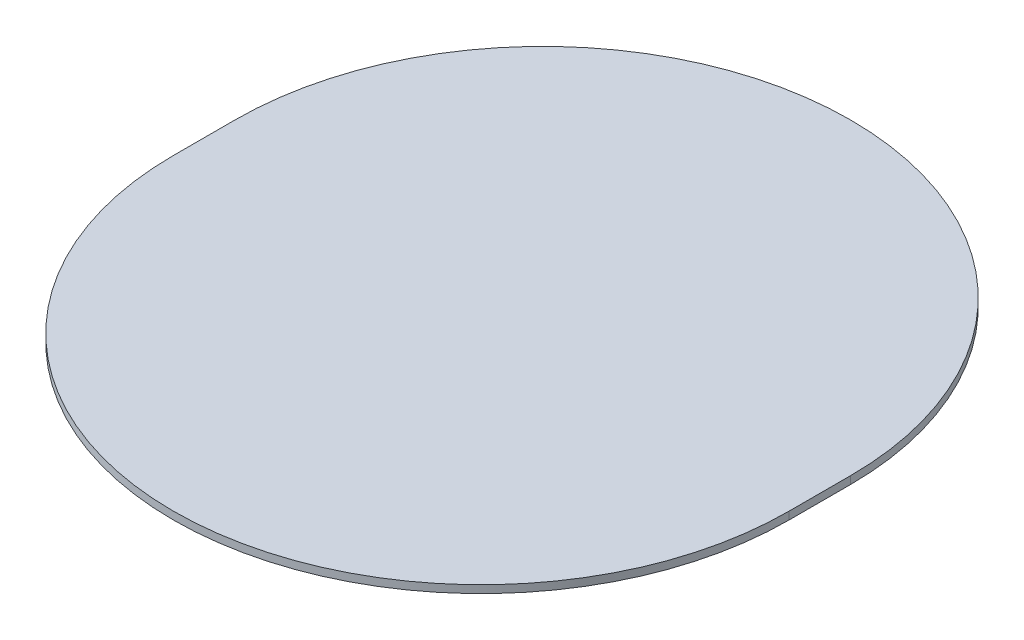
ISO-10303-21;
HEADER;
FILE_DESCRIPTION(('STEP AP214'),'2;1');
FILE_NAME('part.step','',(''),(''),'','','');
FILE_SCHEMA(('AUTOMOTIVE_DESIGN { 1 0 10303 214 1 1 1 1 }'));
ENDSEC;
DATA;
#1=APPLICATION_CONTEXT('core data for automotive mechanical design processes');
#2=APPLICATION_PROTOCOL_DEFINITION('international standard','automotive_design',2000,#1);
#3=PRODUCT_CONTEXT('',#1,'mechanical');
#4=PRODUCT('Part','Part','',(#3));
#5=PRODUCT_RELATED_PRODUCT_CATEGORY('part','',(#4));
#6=PRODUCT_DEFINITION_FORMATION('','',#4);
#7=PRODUCT_DEFINITION_CONTEXT('part definition',#1,'design');
#8=PRODUCT_DEFINITION('design','',#6,#7);
#9=PRODUCT_DEFINITION_SHAPE('','',#8);
#10=(LENGTH_UNIT() NAMED_UNIT(*) SI_UNIT(.MILLI.,.METRE.));
#11=(NAMED_UNIT(*) PLANE_ANGLE_UNIT() SI_UNIT($,.RADIAN.));
#12=(NAMED_UNIT(*) SI_UNIT($,.STERADIAN.) SOLID_ANGLE_UNIT());
#13=UNCERTAINTY_MEASURE_WITH_UNIT(LENGTH_MEASURE(1.E-05),#10,'distance_accuracy_value','');
#14=(GEOMETRIC_REPRESENTATION_CONTEXT(3) GLOBAL_UNCERTAINTY_ASSIGNED_CONTEXT((#13)) GLOBAL_UNIT_ASSIGNED_CONTEXT((#10,
#11,#12)) REPRESENTATION_CONTEXT('',''));
#15=CARTESIAN_POINT('',(0.,0.,0.));
#16=DIRECTION('',(0.,0.,1.));
#17=DIRECTION('',(1.,0.,0.));
#18=AXIS2_PLACEMENT_3D('',#15,#16,#17);
#19=CARTESIAN_POINT('',(0.,3.175,-12.7));
#20=DIRECTION('',(0.,-1.,0.));
#21=DIRECTION('',(0.,0.,-1.));
#22=AXIS2_PLACEMENT_3D('',#19,#20,#21);
#23=CYLINDRICAL_SURFACE('',#22,127.);
#24=CARTESIAN_POINT('',(0.,0.,-12.7));
#25=DIRECTION('',(0.,1.,0.));
#26=DIRECTION('',(0.,0.,-1.));
#27=AXIS2_PLACEMENT_3D('',#24,#25,#26);
#28=CIRCLE('',#27,127.);
#29=CARTESIAN_POINT('',(127.,0.,-12.7));
#30=VERTEX_POINT('',#29);
#31=CARTESIAN_POINT('',(-127.,0.,-12.7));
#32=VERTEX_POINT('',#31);
#33=EDGE_CURVE('E96',#30,#32,#28,.T.);
#34=ORIENTED_EDGE('',*,*,#33,.T.);
#35=DIRECTION('',(0.,-1.,0.));
#36=VECTOR('',#35,1.);
#37=CARTESIAN_POINT('',(-127.,3.175,-12.7));
#38=LINE('',#37,#36);
#39=CARTESIAN_POINT('',(-127.,3.175,-12.7));
#40=VERTEX_POINT('',#39);
#41=EDGE_CURVE('E11',#40,#32,#38,.T.);
#42=ORIENTED_EDGE('',*,*,#41,.F.);
#43=CARTESIAN_POINT('',(0.,3.175,-12.7));
#44=DIRECTION('',(0.,1.,0.));
#45=DIRECTION('',(0.,0.,-1.));
#46=AXIS2_PLACEMENT_3D('',#43,#44,#45);
#47=CIRCLE('',#46,127.);
#48=CARTESIAN_POINT('',(127.,3.175,-12.7));
#49=VERTEX_POINT('',#48);
#50=EDGE_CURVE('E84',#49,#40,#47,.T.);
#51=ORIENTED_EDGE('',*,*,#50,.F.);
#52=DIRECTION('',(0.,-1.,0.));
#53=VECTOR('',#52,1.);
#54=CARTESIAN_POINT('',(127.,3.175,-12.7));
#55=LINE('',#54,#53);
#56=EDGE_CURVE('E92',#49,#30,#55,.T.);
#57=ORIENTED_EDGE('',*,*,#56,.T.);
#58=EDGE_LOOP('',(#34,#42,#51,#57));
#59=FACE_BOUND('',#58,.T.);
#60=ADVANCED_FACE('F33',(#59),#23,.T.);
#61=CARTESIAN_POINT('',(-127.,3.175,12.7));
#62=DIRECTION('',(1.,0.,0.));
#63=DIRECTION('',(0.,0.,-1.));
#64=AXIS2_PLACEMENT_3D('',#61,#62,#63);
#65=PLANE('',#64);
#66=DIRECTION('',(0.,0.,1.));
#67=VECTOR('',#66,1.);
#68=CARTESIAN_POINT('',(-127.,0.,12.7));
#69=LINE('',#68,#67);
#70=CARTESIAN_POINT('',(-127.,0.,12.7));
#71=VERTEX_POINT('',#70);
#72=EDGE_CURVE('E88',#32,#71,#69,.T.);
#73=ORIENTED_EDGE('',*,*,#72,.T.);
#74=DIRECTION('',(0.,-1.,0.));
#75=VECTOR('',#74,1.);
#76=CARTESIAN_POINT('',(-127.,3.175,12.7));
#77=LINE('',#76,#75);
#78=CARTESIAN_POINT('',(-127.,3.175,12.7));
#79=VERTEX_POINT('',#78);
#80=EDGE_CURVE('E41',#79,#71,#77,.T.);
#81=ORIENTED_EDGE('',*,*,#80,.F.);
#82=DIRECTION('',(0.,0.,1.));
#83=VECTOR('',#82,1.);
#84=CARTESIAN_POINT('',(-127.,3.175,12.7));
#85=LINE('',#84,#83);
#86=EDGE_CURVE('E79',#40,#79,#85,.T.);
#87=ORIENTED_EDGE('',*,*,#86,.F.);
#88=ORIENTED_EDGE('',*,*,#41,.T.);
#89=EDGE_LOOP('',(#73,#81,#87,#88));
#90=FACE_BOUND('',#89,.T.);
#91=ADVANCED_FACE('F87',(#90),#65,.F.);
#92=CARTESIAN_POINT('',(0.,3.175,12.7));
#93=DIRECTION('',(0.,-1.,0.));
#94=DIRECTION('',(0.,0.,-1.));
#95=AXIS2_PLACEMENT_3D('',#92,#93,#94);
#96=CYLINDRICAL_SURFACE('',#95,127.);
#97=CARTESIAN_POINT('',(0.,0.,12.7));
#98=DIRECTION('',(0.,1.,0.));
#99=DIRECTION('',(0.,0.,1.));
#100=AXIS2_PLACEMENT_3D('',#97,#98,#99);
#101=CIRCLE('',#100,127.);
#102=CARTESIAN_POINT('',(127.,0.,12.7));
#103=VERTEX_POINT('',#102);
#104=EDGE_CURVE('E66',#71,#103,#101,.T.);
#105=ORIENTED_EDGE('',*,*,#104,.T.);
#106=DIRECTION('',(0.,-1.,0.));
#107=VECTOR('',#106,1.);
#108=CARTESIAN_POINT('',(127.,3.175,12.7));
#109=LINE('',#108,#107);
#110=CARTESIAN_POINT('',(127.,3.175,12.7));
#111=VERTEX_POINT('',#110);
#112=EDGE_CURVE('E89',#111,#103,#109,.T.);
#113=ORIENTED_EDGE('',*,*,#112,.F.);
#114=CARTESIAN_POINT('',(0.,3.175,12.7));
#115=DIRECTION('',(0.,1.,0.));
#116=DIRECTION('',(0.,0.,1.));
#117=AXIS2_PLACEMENT_3D('',#114,#115,#116);
#118=CIRCLE('',#117,127.);
#119=EDGE_CURVE('E82',#79,#111,#118,.T.);
#120=ORIENTED_EDGE('',*,*,#119,.F.);
#121=ORIENTED_EDGE('',*,*,#80,.T.);
#122=EDGE_LOOP('',(#105,#113,#120,#121));
#123=FACE_BOUND('',#122,.T.);
#124=ADVANCED_FACE('F90',(#123),#96,.T.);
#125=CARTESIAN_POINT('',(127.,3.175,12.7));
#126=DIRECTION('',(-1.,0.,0.));
#127=DIRECTION('',(0.,0.,1.));
#128=AXIS2_PLACEMENT_3D('',#125,#126,#127);
#129=PLANE('',#128);
#130=DIRECTION('',(0.,0.,-1.));
#131=VECTOR('',#130,1.);
#132=CARTESIAN_POINT('',(127.,0.,12.7));
#133=LINE('',#132,#131);
#134=EDGE_CURVE('E72',#103,#30,#133,.T.);
#135=ORIENTED_EDGE('',*,*,#134,.T.);
#136=ORIENTED_EDGE('',*,*,#56,.F.);
#137=DIRECTION('',(0.,0.,-1.));
#138=VECTOR('',#137,1.);
#139=CARTESIAN_POINT('',(127.,3.175,12.7));
#140=LINE('',#139,#138);
#141=EDGE_CURVE('E49',#111,#49,#140,.T.);
#142=ORIENTED_EDGE('',*,*,#141,.F.);
#143=ORIENTED_EDGE('',*,*,#112,.T.);
#144=EDGE_LOOP('',(#135,#136,#142,#143));
#145=FACE_BOUND('',#144,.T.);
#146=ADVANCED_FACE('F103',(#145),#129,.F.);
#147=CARTESIAN_POINT('',(0.,3.175,-12.7));
#148=DIRECTION('',(0.,-1.,0.));
#149=DIRECTION('',(0.,0.,-1.));
#150=AXIS2_PLACEMENT_3D('',#147,#148,#149);
#151=PLANE('',#150);
#152=ORIENTED_EDGE('',*,*,#50,.T.);
#153=ORIENTED_EDGE('',*,*,#86,.T.);
#154=ORIENTED_EDGE('',*,*,#119,.T.);
#155=ORIENTED_EDGE('',*,*,#141,.T.);
#156=EDGE_LOOP('',(#152,#153,#154,#155));
#157=FACE_BOUND('',#156,.T.);
#158=ADVANCED_FACE('F80',(#157),#151,.F.);
#159=CARTESIAN_POINT('',(0.,0.,-12.7));
#160=DIRECTION('',(0.,-1.,0.));
#161=DIRECTION('',(0.,0.,-1.));
#162=AXIS2_PLACEMENT_3D('',#159,#160,#161);
#163=PLANE('',#162);
#164=ORIENTED_EDGE('',*,*,#33,.F.);
#165=ORIENTED_EDGE('',*,*,#134,.F.);
#166=ORIENTED_EDGE('',*,*,#104,.F.);
#167=ORIENTED_EDGE('',*,*,#72,.F.);
#168=EDGE_LOOP('',(#164,#165,#166,#167));
#169=FACE_BOUND('',#168,.T.);
#170=ADVANCED_FACE('F106',(#169),#163,.T.);
#171=CLOSED_SHELL('',(#60,#91,#124,#146,#158,#170));
#172=MANIFOLD_SOLID_BREP('B2',#171);
#173=ADVANCED_BREP_SHAPE_REPRESENTATION('',(#18,#172),#14);
#174=SHAPE_DEFINITION_REPRESENTATION(#9,#173);
ENDSEC;
END-ISO-10303-21;
